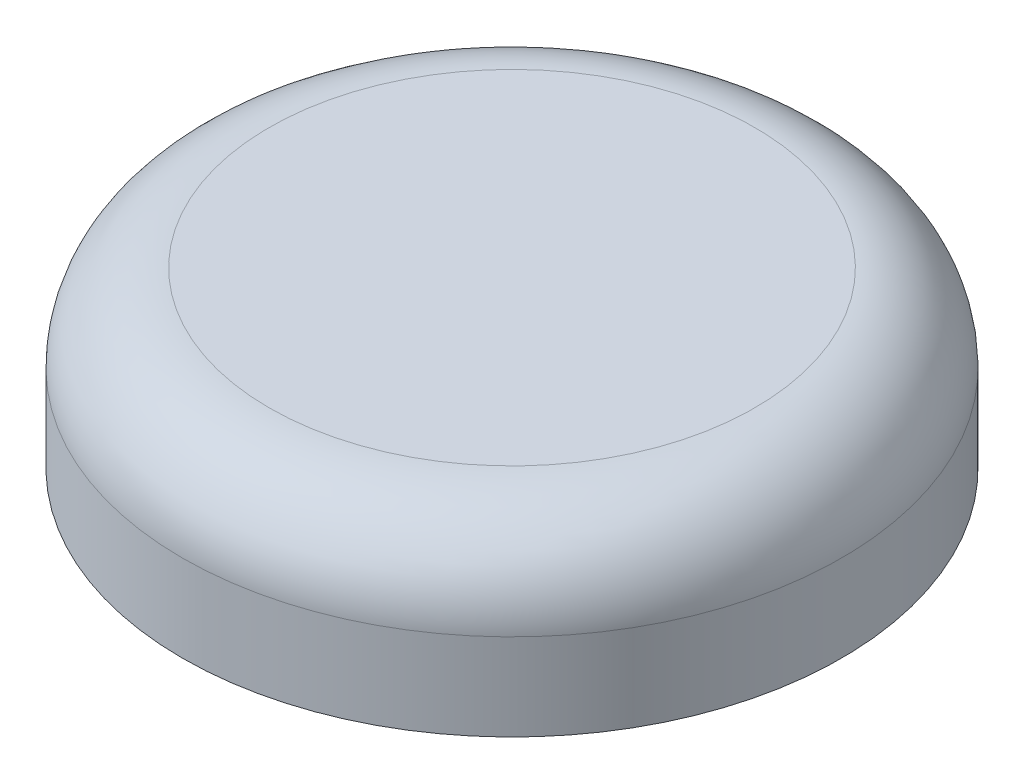
ISO-10303-21;
HEADER;
FILE_DESCRIPTION(('STEP AP214'),'2;1');
FILE_NAME('part.step','',(''),(''),'','','');
FILE_SCHEMA(('AUTOMOTIVE_DESIGN { 1 0 10303 214 1 1 1 1 }'));
ENDSEC;
DATA;
#1=APPLICATION_CONTEXT('core data for automotive mechanical design processes');
#2=APPLICATION_PROTOCOL_DEFINITION('international standard','automotive_design',2000,#1);
#3=PRODUCT_CONTEXT('',#1,'mechanical');
#4=PRODUCT('Part','Part','',(#3));
#5=PRODUCT_RELATED_PRODUCT_CATEGORY('part','',(#4));
#6=PRODUCT_DEFINITION_FORMATION('','',#4);
#7=PRODUCT_DEFINITION_CONTEXT('part definition',#1,'design');
#8=PRODUCT_DEFINITION('design','',#6,#7);
#9=PRODUCT_DEFINITION_SHAPE('','',#8);
#10=(LENGTH_UNIT() NAMED_UNIT(*) SI_UNIT(.MILLI.,.METRE.));
#11=(NAMED_UNIT(*) PLANE_ANGLE_UNIT() SI_UNIT($,.RADIAN.));
#12=(NAMED_UNIT(*) SI_UNIT($,.STERADIAN.) SOLID_ANGLE_UNIT());
#13=UNCERTAINTY_MEASURE_WITH_UNIT(LENGTH_MEASURE(1.E-05),#10,'distance_accuracy_value','');
#14=(GEOMETRIC_REPRESENTATION_CONTEXT(3) GLOBAL_UNCERTAINTY_ASSIGNED_CONTEXT((#13)) GLOBAL_UNIT_ASSIGNED_CONTEXT((#10,
#11,#12)) REPRESENTATION_CONTEXT('',''));
#15=CARTESIAN_POINT('',(0.,0.,0.));
#16=DIRECTION('',(0.,0.,1.));
#17=DIRECTION('',(1.,0.,0.));
#18=AXIS2_PLACEMENT_3D('',#15,#16,#17);
#19=CARTESIAN_POINT('',(0.,15.,0.));
#20=DIRECTION('',(0.,-1.,0.));
#21=DIRECTION('',(0.,0.,-1.));
#22=AXIS2_PLACEMENT_3D('',#19,#20,#21);
#23=CYLINDRICAL_SURFACE('',#22,28.5);
#24=CARTESIAN_POINT('',(0.,7.5,0.));
#25=DIRECTION('',(0.,1.,0.));
#26=DIRECTION('',(0.,0.,1.));
#27=AXIS2_PLACEMENT_3D('',#24,#25,#26);
#28=CIRCLE('',#27,28.5);
#29=CARTESIAN_POINT('',(0.,7.5,28.5));
#30=VERTEX_POINT('',#29);
#31=EDGE_CURVE('E11',#30,#30,#28,.F.);
#32=ORIENTED_EDGE('',*,*,#31,.T.);
#33=EDGE_LOOP('',(#32));
#34=FACE_BOUND('',#33,.T.);
#35=CARTESIAN_POINT('',(0.,0.,0.));
#36=DIRECTION('',(0.,1.,0.));
#37=DIRECTION('',(0.,0.,1.));
#38=AXIS2_PLACEMENT_3D('',#35,#36,#37);
#39=CIRCLE('',#38,28.5);
#40=CARTESIAN_POINT('',(0.,0.,28.5));
#41=VERTEX_POINT('',#40);
#42=EDGE_CURVE('E87',#41,#41,#39,.T.);
#43=ORIENTED_EDGE('',*,*,#42,.T.);
#44=EDGE_LOOP('',(#43));
#45=FACE_BOUND('',#44,.T.);
#46=ADVANCED_FACE('F33',(#34,#45),#23,.T.);
#47=CARTESIAN_POINT('',(0.,15.,0.));
#48=DIRECTION('',(0.,1.,0.));
#49=DIRECTION('',(0.,0.,1.));
#50=AXIS2_PLACEMENT_3D('',#47,#48,#49);
#51=PLANE('',#50);
#52=CARTESIAN_POINT('',(0.,15.,0.));
#53=DIRECTION('',(0.,1.,0.));
#54=DIRECTION('',(0.,0.,1.));
#55=AXIS2_PLACEMENT_3D('',#52,#53,#54);
#56=CIRCLE('',#55,21.);
#57=CARTESIAN_POINT('',(0.,15.,21.));
#58=VERTEX_POINT('',#57);
#59=EDGE_CURVE('E41',#58,#58,#56,.T.);
#60=ORIENTED_EDGE('',*,*,#59,.T.);
#61=EDGE_LOOP('',(#60));
#62=FACE_BOUND('',#61,.T.);
#63=ADVANCED_FACE('F92',(#62),#51,.T.);
#64=CARTESIAN_POINT('',(0.,0.,0.));
#65=DIRECTION('',(0.,1.,0.));
#66=DIRECTION('',(0.,0.,1.));
#67=AXIS2_PLACEMENT_3D('',#64,#65,#66);
#68=PLANE('',#67);
#69=CARTESIAN_POINT('',(16.25,0.,-16.25));
#70=DIRECTION('',(0.,-1.,0.));
#71=DIRECTION('',(0.,0.,-1.));
#72=AXIS2_PLACEMENT_3D('',#69,#70,#71);
#73=CIRCLE('',#72,1.47319999999999);
#74=CARTESIAN_POINT('',(16.25,0.,-17.7232));
#75=VERTEX_POINT('',#74);
#76=EDGE_CURVE('E65',#75,#75,#73,.T.);
#77=ORIENTED_EDGE('',*,*,#76,.F.);
#78=EDGE_LOOP('',(#77));
#79=FACE_BOUND('',#78,.T.);
#80=CARTESIAN_POINT('',(-16.25,0.,-16.25));
#81=DIRECTION('',(0.,-1.,0.));
#82=DIRECTION('',(0.,0.,-1.));
#83=AXIS2_PLACEMENT_3D('',#80,#81,#82);
#84=CIRCLE('',#83,1.47319999999999);
#85=CARTESIAN_POINT('',(-16.25,0.,-17.7232));
#86=VERTEX_POINT('',#85);
#87=EDGE_CURVE('E64',#86,#86,#84,.T.);
#88=ORIENTED_EDGE('',*,*,#87,.F.);
#89=EDGE_LOOP('',(#88));
#90=FACE_BOUND('',#89,.T.);
#91=CARTESIAN_POINT('',(-16.25,0.,16.25));
#92=DIRECTION('',(0.,-1.,0.));
#93=DIRECTION('',(0.,0.,-1.));
#94=AXIS2_PLACEMENT_3D('',#91,#92,#93);
#95=CIRCLE('',#94,1.47319999999999);
#96=CARTESIAN_POINT('',(-16.25,0.,14.7768));
#97=VERTEX_POINT('',#96);
#98=EDGE_CURVE('E75',#97,#97,#95,.T.);
#99=ORIENTED_EDGE('',*,*,#98,.F.);
#100=EDGE_LOOP('',(#99));
#101=FACE_BOUND('',#100,.T.);
#102=CARTESIAN_POINT('',(16.25,0.,16.25));
#103=DIRECTION('',(0.,-1.,0.));
#104=DIRECTION('',(0.,0.,-1.));
#105=AXIS2_PLACEMENT_3D('',#102,#103,#104);
#106=CIRCLE('',#105,1.47319999999999);
#107=CARTESIAN_POINT('',(16.25,0.,14.7768));
#108=VERTEX_POINT('',#107);
#109=EDGE_CURVE('E81',#108,#108,#106,.T.);
#110=ORIENTED_EDGE('',*,*,#109,.F.);
#111=EDGE_LOOP('',(#110));
#112=FACE_BOUND('',#111,.T.);
#113=ORIENTED_EDGE('',*,*,#42,.F.);
#114=EDGE_LOOP('',(#113));
#115=FACE_BOUND('',#114,.T.);
#116=ADVANCED_FACE('F96',(#79,#90,#101,#112,#115),#68,.F.);
#117=CARTESIAN_POINT('',(0.,7.5,0.));
#118=DIRECTION('',(0.,1.,0.));
#119=DIRECTION('',(0.,0.,1.));
#120=AXIS2_PLACEMENT_3D('',#117,#118,#119);
#121=TOROIDAL_SURFACE('',#120,21.,7.5);
#122=ORIENTED_EDGE('',*,*,#31,.F.);
#123=EDGE_LOOP('',(#122));
#124=FACE_BOUND('',#123,.T.);
#125=ORIENTED_EDGE('',*,*,#59,.F.);
#126=EDGE_LOOP('',(#125));
#127=FACE_BOUND('',#126,.T.);
#128=ADVANCED_FACE('F35',(#124,#127),#121,.T.);
#129=CARTESIAN_POINT('',(16.25,3.,16.25));
#130=DIRECTION('',(0.,-1.,0.));
#131=DIRECTION('',(0.,0.,-1.));
#132=AXIS2_PLACEMENT_3D('',#129,#130,#131);
#133=CONICAL_SURFACE('',#132,1.47319999999999,1.02974425867666);
#134=CARTESIAN_POINT('',(16.25,3.8851878639514,16.25));
#135=VERTEX_POINT('',#134);
#136=VERTEX_LOOP('',#135);
#137=FACE_BOUND('',#136,.T.);
#138=CARTESIAN_POINT('',(16.25,3.,16.25));
#139=DIRECTION('',(0.,-1.,0.));
#140=DIRECTION('',(0.,0.,-1.));
#141=AXIS2_PLACEMENT_3D('',#138,#139,#140);
#142=CIRCLE('',#141,1.47319999999999);
#143=CARTESIAN_POINT('',(16.25,3.,14.7768));
#144=VERTEX_POINT('',#143);
#145=EDGE_CURVE('E84',#144,#144,#142,.T.);
#146=ORIENTED_EDGE('',*,*,#145,.T.);
#147=EDGE_LOOP('',(#146));
#148=FACE_BOUND('',#147,.T.);
#149=ADVANCED_FACE('F95',(#137,#148),#133,.F.);
#150=CARTESIAN_POINT('',(16.25,0.,16.25));
#151=DIRECTION('',(0.,-1.,0.));
#152=DIRECTION('',(0.,0.,-1.));
#153=AXIS2_PLACEMENT_3D('',#150,#151,#152);
#154=CYLINDRICAL_SURFACE('',#153,1.47319999999999);
#155=ORIENTED_EDGE('',*,*,#145,.F.);
#156=EDGE_LOOP('',(#155));
#157=FACE_BOUND('',#156,.T.);
#158=ORIENTED_EDGE('',*,*,#109,.T.);
#159=EDGE_LOOP('',(#158));
#160=FACE_BOUND('',#159,.T.);
#161=ADVANCED_FACE('F102',(#157,#160),#154,.F.);
#162=CARTESIAN_POINT('',(-16.25,3.,16.25));
#163=DIRECTION('',(0.,-1.,0.));
#164=DIRECTION('',(0.,0.,-1.));
#165=AXIS2_PLACEMENT_3D('',#162,#163,#164);
#166=CONICAL_SURFACE('',#165,1.47319999999999,1.02974425867666);
#167=CARTESIAN_POINT('',(-16.25,3.8851878639514,16.25));
#168=VERTEX_POINT('',#167);
#169=VERTEX_LOOP('',#168);
#170=FACE_BOUND('',#169,.T.);
#171=CARTESIAN_POINT('',(-16.25,3.,16.25));
#172=DIRECTION('',(0.,-1.,0.));
#173=DIRECTION('',(0.,0.,-1.));
#174=AXIS2_PLACEMENT_3D('',#171,#172,#173);
#175=CIRCLE('',#174,1.47319999999999);
#176=CARTESIAN_POINT('',(-16.25,3.,14.7768));
#177=VERTEX_POINT('',#176);
#178=EDGE_CURVE('E78',#177,#177,#175,.T.);
#179=ORIENTED_EDGE('',*,*,#178,.T.);
#180=EDGE_LOOP('',(#179));
#181=FACE_BOUND('',#180,.T.);
#182=ADVANCED_FACE('F117',(#170,#181),#166,.F.);
#183=CARTESIAN_POINT('',(-16.25,0.,16.25));
#184=DIRECTION('',(0.,-1.,0.));
#185=DIRECTION('',(0.,0.,-1.));
#186=AXIS2_PLACEMENT_3D('',#183,#184,#185);
#187=CYLINDRICAL_SURFACE('',#186,1.47319999999999);
#188=ORIENTED_EDGE('',*,*,#178,.F.);
#189=EDGE_LOOP('',(#188));
#190=FACE_BOUND('',#189,.T.);
#191=ORIENTED_EDGE('',*,*,#98,.T.);
#192=EDGE_LOOP('',(#191));
#193=FACE_BOUND('',#192,.T.);
#194=ADVANCED_FACE('F121',(#190,#193),#187,.F.);
#195=CARTESIAN_POINT('',(-16.25,3.,-16.25));
#196=DIRECTION('',(0.,-1.,0.));
#197=DIRECTION('',(0.,0.,-1.));
#198=AXIS2_PLACEMENT_3D('',#195,#196,#197);
#199=CONICAL_SURFACE('',#198,1.47319999999999,1.02974425867666);
#200=CARTESIAN_POINT('',(-16.25,3.8851878639514,-16.25));
#201=VERTEX_POINT('',#200);
#202=VERTEX_LOOP('',#201);
#203=FACE_BOUND('',#202,.T.);
#204=CARTESIAN_POINT('',(-16.25,3.,-16.25));
#205=DIRECTION('',(0.,-1.,0.));
#206=DIRECTION('',(0.,0.,-1.));
#207=AXIS2_PLACEMENT_3D('',#204,#205,#206);
#208=CIRCLE('',#207,1.47319999999999);
#209=CARTESIAN_POINT('',(-16.25,3.,-17.7232));
#210=VERTEX_POINT('',#209);
#211=EDGE_CURVE('E68',#210,#210,#208,.T.);
#212=ORIENTED_EDGE('',*,*,#211,.T.);
#213=EDGE_LOOP('',(#212));
#214=FACE_BOUND('',#213,.T.);
#215=ADVANCED_FACE('F124',(#203,#214),#199,.F.);
#216=CARTESIAN_POINT('',(-16.25,0.,-16.25));
#217=DIRECTION('',(0.,-1.,0.));
#218=DIRECTION('',(0.,0.,-1.));
#219=AXIS2_PLACEMENT_3D('',#216,#217,#218);
#220=CYLINDRICAL_SURFACE('',#219,1.47319999999999);
#221=ORIENTED_EDGE('',*,*,#211,.F.);
#222=EDGE_LOOP('',(#221));
#223=FACE_BOUND('',#222,.T.);
#224=ORIENTED_EDGE('',*,*,#87,.T.);
#225=EDGE_LOOP('',(#224));
#226=FACE_BOUND('',#225,.T.);
#227=ADVANCED_FACE('F58',(#223,#226),#220,.F.);
#228=CARTESIAN_POINT('',(16.25,3.,-16.25));
#229=DIRECTION('',(0.,-1.,0.));
#230=DIRECTION('',(0.,0.,-1.));
#231=AXIS2_PLACEMENT_3D('',#228,#229,#230);
#232=CONICAL_SURFACE('',#231,1.47319999999999,1.02974425867666);
#233=CARTESIAN_POINT('',(16.25,3.8851878639514,-16.25));
#234=VERTEX_POINT('',#233);
#235=VERTEX_LOOP('',#234);
#236=FACE_BOUND('',#235,.T.);
#237=CARTESIAN_POINT('',(16.25,3.,-16.25));
#238=DIRECTION('',(0.,-1.,0.));
#239=DIRECTION('',(0.,0.,-1.));
#240=AXIS2_PLACEMENT_3D('',#237,#238,#239);
#241=CIRCLE('',#240,1.47319999999999);
#242=CARTESIAN_POINT('',(16.25,3.,-17.7232));
#243=VERTEX_POINT('',#242);
#244=EDGE_CURVE('E62',#243,#243,#241,.T.);
#245=ORIENTED_EDGE('',*,*,#244,.T.);
#246=EDGE_LOOP('',(#245));
#247=FACE_BOUND('',#246,.T.);
#248=ADVANCED_FACE('F54',(#236,#247),#232,.F.);
#249=CARTESIAN_POINT('',(16.25,0.,-16.25));
#250=DIRECTION('',(0.,-1.,0.));
#251=DIRECTION('',(0.,0.,-1.));
#252=AXIS2_PLACEMENT_3D('',#249,#250,#251);
#253=CYLINDRICAL_SURFACE('',#252,1.47319999999999);
#254=ORIENTED_EDGE('',*,*,#244,.F.);
#255=EDGE_LOOP('',(#254));
#256=FACE_BOUND('',#255,.T.);
#257=ORIENTED_EDGE('',*,*,#76,.T.);
#258=EDGE_LOOP('',(#257));
#259=FACE_BOUND('',#258,.T.);
#260=ADVANCED_FACE('F57',(#256,#259),#253,.F.);
#261=CLOSED_SHELL('',(#46,#63,#116,#128,#149,#161,#182,#194,#215,#227,#248,#260));
#262=MANIFOLD_SOLID_BREP('B2',#261);
#263=ADVANCED_BREP_SHAPE_REPRESENTATION('',(#18,#262),#14);
#264=SHAPE_DEFINITION_REPRESENTATION(#9,#263);
ENDSEC;
END-ISO-10303-21;
